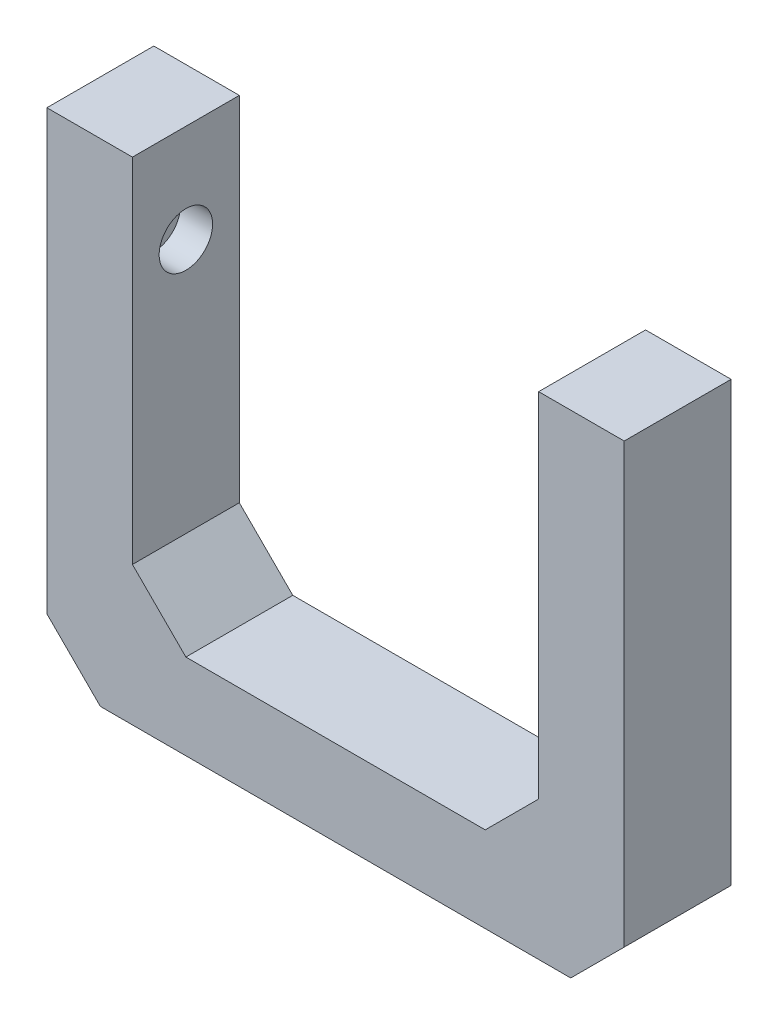
ISO-10303-21;
HEADER;
FILE_DESCRIPTION(('STEP AP214'),'2;1');
FILE_NAME('part.step','',(''),(''),'','','');
FILE_SCHEMA(('AUTOMOTIVE_DESIGN { 1 0 10303 214 1 1 1 1 }'));
ENDSEC;
DATA;
#1=APPLICATION_CONTEXT('core data for automotive mechanical design processes');
#2=APPLICATION_PROTOCOL_DEFINITION('international standard','automotive_design',2000,#1);
#3=PRODUCT_CONTEXT('',#1,'mechanical');
#4=PRODUCT('Part','Part','',(#3));
#5=PRODUCT_RELATED_PRODUCT_CATEGORY('part','',(#4));
#6=PRODUCT_DEFINITION_FORMATION('','',#4);
#7=PRODUCT_DEFINITION_CONTEXT('part definition',#1,'design');
#8=PRODUCT_DEFINITION('design','',#6,#7);
#9=PRODUCT_DEFINITION_SHAPE('','',#8);
#10=(LENGTH_UNIT() NAMED_UNIT(*) SI_UNIT(.MILLI.,.METRE.));
#11=(NAMED_UNIT(*) PLANE_ANGLE_UNIT() SI_UNIT($,.RADIAN.));
#12=(NAMED_UNIT(*) SI_UNIT($,.STERADIAN.) SOLID_ANGLE_UNIT());
#13=UNCERTAINTY_MEASURE_WITH_UNIT(LENGTH_MEASURE(1.E-05),#10,'distance_accuracy_value','');
#14=(GEOMETRIC_REPRESENTATION_CONTEXT(3) GLOBAL_UNCERTAINTY_ASSIGNED_CONTEXT((#13)) GLOBAL_UNIT_ASSIGNED_CONTEXT((#10,
#11,#12)) REPRESENTATION_CONTEXT('',''));
#15=CARTESIAN_POINT('',(0.,0.,0.));
#16=DIRECTION('',(0.,0.,1.));
#17=DIRECTION('',(1.,0.,0.));
#18=AXIS2_PLACEMENT_3D('',#15,#16,#17);
#19=CARTESIAN_POINT('',(-27.,-3.00000000000001,10.));
#20=DIRECTION('',(1.,0.,0.));
#21=DIRECTION('',(0.,1.,0.));
#22=AXIS2_PLACEMENT_3D('',#19,#20,#21);
#23=PLANE('',#22);
#24=DIRECTION('',(0.,-1.,0.));
#25=VECTOR('',#24,1.);
#26=CARTESIAN_POINT('',(-27.,-3.00000000000001,0.));
#27=LINE('',#26,#25);
#28=CARTESIAN_POINT('',(-27.,38.,0.));
#29=VERTEX_POINT('',#28);
#30=CARTESIAN_POINT('',(-27.,-3.00000000000001,0.));
#31=VERTEX_POINT('',#30);
#32=EDGE_CURVE('E163',#29,#31,#27,.T.);
#33=ORIENTED_EDGE('',*,*,#32,.T.);
#34=DIRECTION('',(0.,0.,-1.));
#35=VECTOR('',#34,1.);
#36=CARTESIAN_POINT('',(-27.,-3.00000000000001,10.));
#37=LINE('',#36,#35);
#38=CARTESIAN_POINT('',(-27.,-3.00000000000001,10.));
#39=VERTEX_POINT('',#38);
#40=EDGE_CURVE('E11',#39,#31,#37,.T.);
#41=ORIENTED_EDGE('',*,*,#40,.F.);
#42=DIRECTION('',(0.,-1.,0.));
#43=VECTOR('',#42,1.);
#44=CARTESIAN_POINT('',(-27.,-3.00000000000001,10.));
#45=LINE('',#44,#43);
#46=CARTESIAN_POINT('',(-27.,38.,10.));
#47=VERTEX_POINT('',#46);
#48=EDGE_CURVE('E186',#47,#39,#45,.T.);
#49=ORIENTED_EDGE('',*,*,#48,.F.);
#50=DIRECTION('',(0.,0.,-1.));
#51=VECTOR('',#50,1.);
#52=CARTESIAN_POINT('',(-27.,38.,10.));
#53=LINE('',#52,#51);
#54=EDGE_CURVE('E159',#47,#29,#53,.T.);
#55=ORIENTED_EDGE('',*,*,#54,.T.);
#56=EDGE_LOOP('',(#33,#41,#49,#55));
#57=FACE_BOUND('',#56,.T.);
#58=ADVANCED_FACE('F43',(#57),#23,.F.);
#59=CARTESIAN_POINT('',(-22.,-8.00000000000001,10.));
#60=DIRECTION('',(0.707106781186547,0.707106781186548,0.));
#61=DIRECTION('',(-0.707106781186548,0.707106781186547,0.));
#62=AXIS2_PLACEMENT_3D('',#59,#60,#61);
#63=PLANE('',#62);
#64=DIRECTION('',(0.707106781186548,-0.707106781186547,0.));
#65=VECTOR('',#64,1.);
#66=CARTESIAN_POINT('',(-22.,-8.00000000000001,0.));
#67=LINE('',#66,#65);
#68=CARTESIAN_POINT('',(-22.,-8.00000000000001,0.));
#69=VERTEX_POINT('',#68);
#70=EDGE_CURVE('E166',#31,#69,#67,.T.);
#71=ORIENTED_EDGE('',*,*,#70,.T.);
#72=DIRECTION('',(0.,0.,-1.));
#73=VECTOR('',#72,1.);
#74=CARTESIAN_POINT('',(-22.,-8.00000000000001,10.));
#75=LINE('',#74,#73);
#76=CARTESIAN_POINT('',(-22.,-8.00000000000001,10.));
#77=VERTEX_POINT('',#76);
#78=EDGE_CURVE('E51',#77,#69,#75,.T.);
#79=ORIENTED_EDGE('',*,*,#78,.F.);
#80=DIRECTION('',(0.707106781186548,-0.707106781186547,0.));
#81=VECTOR('',#80,1.);
#82=CARTESIAN_POINT('',(-22.,-8.00000000000001,10.));
#83=LINE('',#82,#81);
#84=EDGE_CURVE('E114',#39,#77,#83,.T.);
#85=ORIENTED_EDGE('',*,*,#84,.F.);
#86=ORIENTED_EDGE('',*,*,#40,.T.);
#87=EDGE_LOOP('',(#71,#79,#85,#86));
#88=FACE_BOUND('',#87,.T.);
#89=ADVANCED_FACE('F265',(#88),#63,.F.);
#90=CARTESIAN_POINT('',(22.,-7.99999999999999,10.));
#91=DIRECTION('',(0.,1.,0.));
#92=DIRECTION('',(-1.,0.,0.));
#93=AXIS2_PLACEMENT_3D('',#90,#91,#92);
#94=PLANE('',#93);
#95=DIRECTION('',(1.,0.,0.));
#96=VECTOR('',#95,1.);
#97=CARTESIAN_POINT('',(22.,-7.99999999999999,0.));
#98=LINE('',#97,#96);
#99=CARTESIAN_POINT('',(22.,-7.99999999999999,0.));
#100=VERTEX_POINT('',#99);
#101=EDGE_CURVE('E169',#69,#100,#98,.T.);
#102=ORIENTED_EDGE('',*,*,#101,.T.);
#103=DIRECTION('',(0.,0.,-1.));
#104=VECTOR('',#103,1.);
#105=CARTESIAN_POINT('',(22.,-7.99999999999999,10.));
#106=LINE('',#105,#104);
#107=CARTESIAN_POINT('',(22.,-7.99999999999999,10.));
#108=VERTEX_POINT('',#107);
#109=EDGE_CURVE('E205',#108,#100,#106,.T.);
#110=ORIENTED_EDGE('',*,*,#109,.F.);
#111=DIRECTION('',(1.,0.,0.));
#112=VECTOR('',#111,1.);
#113=CARTESIAN_POINT('',(22.,-7.99999999999999,10.));
#114=LINE('',#113,#112);
#115=EDGE_CURVE('E213',#77,#108,#114,.T.);
#116=ORIENTED_EDGE('',*,*,#115,.F.);
#117=ORIENTED_EDGE('',*,*,#78,.T.);
#118=EDGE_LOOP('',(#102,#110,#116,#117));
#119=FACE_BOUND('',#118,.T.);
#120=ADVANCED_FACE('F211',(#119),#94,.F.);
#121=CARTESIAN_POINT('',(27.,-2.99999999999999,10.));
#122=DIRECTION('',(-0.707106781186548,0.707106781186547,0.));
#123=DIRECTION('',(-0.707106781186547,-0.707106781186548,0.));
#124=AXIS2_PLACEMENT_3D('',#121,#122,#123);
#125=PLANE('',#124);
#126=DIRECTION('',(0.707106781186547,0.707106781186548,0.));
#127=VECTOR('',#126,1.);
#128=CARTESIAN_POINT('',(27.,-2.99999999999999,0.));
#129=LINE('',#128,#127);
#130=CARTESIAN_POINT('',(27.,-2.99999999999999,0.));
#131=VERTEX_POINT('',#130);
#132=EDGE_CURVE('E171',#100,#131,#129,.T.);
#133=ORIENTED_EDGE('',*,*,#132,.T.);
#134=DIRECTION('',(0.,0.,-1.));
#135=VECTOR('',#134,1.);
#136=CARTESIAN_POINT('',(27.,-2.99999999999999,10.));
#137=LINE('',#136,#135);
#138=CARTESIAN_POINT('',(27.,-2.99999999999999,10.));
#139=VERTEX_POINT('',#138);
#140=EDGE_CURVE('E202',#139,#131,#137,.T.);
#141=ORIENTED_EDGE('',*,*,#140,.F.);
#142=DIRECTION('',(0.707106781186547,0.707106781186548,0.));
#143=VECTOR('',#142,1.);
#144=CARTESIAN_POINT('',(27.,-2.99999999999999,10.));
#145=LINE('',#144,#143);
#146=EDGE_CURVE('E231',#108,#139,#145,.T.);
#147=ORIENTED_EDGE('',*,*,#146,.F.);
#148=ORIENTED_EDGE('',*,*,#109,.T.);
#149=EDGE_LOOP('',(#133,#141,#147,#148));
#150=FACE_BOUND('',#149,.T.);
#151=ADVANCED_FACE('F222',(#150),#125,.F.);
#152=CARTESIAN_POINT('',(27.,38.,10.));
#153=DIRECTION('',(-1.,0.,0.));
#154=DIRECTION('',(0.,-1.,0.));
#155=AXIS2_PLACEMENT_3D('',#152,#153,#154);
#156=PLANE('',#155);
#157=DIRECTION('',(0.,1.,0.));
#158=VECTOR('',#157,1.);
#159=CARTESIAN_POINT('',(27.,38.,0.));
#160=LINE('',#159,#158);
#161=CARTESIAN_POINT('',(27.,38.,0.));
#162=VERTEX_POINT('',#161);
#163=EDGE_CURVE('E173',#131,#162,#160,.T.);
#164=ORIENTED_EDGE('',*,*,#163,.T.);
#165=DIRECTION('',(0.,0.,-1.));
#166=VECTOR('',#165,1.);
#167=CARTESIAN_POINT('',(27.,38.,10.));
#168=LINE('',#167,#166);
#169=CARTESIAN_POINT('',(27.,38.,10.));
#170=VERTEX_POINT('',#169);
#171=EDGE_CURVE('E199',#170,#162,#168,.T.);
#172=ORIENTED_EDGE('',*,*,#171,.F.);
#173=DIRECTION('',(0.,1.,0.));
#174=VECTOR('',#173,1.);
#175=CARTESIAN_POINT('',(27.,38.,10.));
#176=LINE('',#175,#174);
#177=EDGE_CURVE('E228',#139,#170,#176,.T.);
#178=ORIENTED_EDGE('',*,*,#177,.F.);
#179=ORIENTED_EDGE('',*,*,#140,.T.);
#180=EDGE_LOOP('',(#164,#172,#178,#179));
#181=FACE_BOUND('',#180,.T.);
#182=ADVANCED_FACE('F226',(#181),#156,.F.);
#183=CARTESIAN_POINT('',(19.,38.,10.));
#184=DIRECTION('',(0.,-1.,0.));
#185=DIRECTION('',(1.,0.,0.));
#186=AXIS2_PLACEMENT_3D('',#183,#184,#185);
#187=PLANE('',#186);
#188=DIRECTION('',(-1.,0.,0.));
#189=VECTOR('',#188,1.);
#190=CARTESIAN_POINT('',(19.,38.,0.));
#191=LINE('',#190,#189);
#192=CARTESIAN_POINT('',(19.,38.,0.));
#193=VERTEX_POINT('',#192);
#194=EDGE_CURVE('E175',#162,#193,#191,.T.);
#195=ORIENTED_EDGE('',*,*,#194,.T.);
#196=DIRECTION('',(0.,0.,-1.));
#197=VECTOR('',#196,1.);
#198=CARTESIAN_POINT('',(19.,38.,10.));
#199=LINE('',#198,#197);
#200=CARTESIAN_POINT('',(19.,38.,10.));
#201=VERTEX_POINT('',#200);
#202=EDGE_CURVE('E196',#201,#193,#199,.T.);
#203=ORIENTED_EDGE('',*,*,#202,.F.);
#204=DIRECTION('',(-1.,0.,0.));
#205=VECTOR('',#204,1.);
#206=CARTESIAN_POINT('',(19.,38.,10.));
#207=LINE('',#206,#205);
#208=EDGE_CURVE('E230',#170,#201,#207,.T.);
#209=ORIENTED_EDGE('',*,*,#208,.F.);
#210=ORIENTED_EDGE('',*,*,#171,.T.);
#211=EDGE_LOOP('',(#195,#203,#209,#210));
#212=FACE_BOUND('',#211,.T.);
#213=ADVANCED_FACE('F278',(#212),#187,.F.);
#214=CARTESIAN_POINT('',(19.,5.,10.));
#215=DIRECTION('',(1.,0.,0.));
#216=DIRECTION('',(0.,1.,0.));
#217=AXIS2_PLACEMENT_3D('',#214,#215,#216);
#218=PLANE('',#217);
#219=DIRECTION('',(0.,-1.,0.));
#220=VECTOR('',#219,1.);
#221=CARTESIAN_POINT('',(19.,5.,0.));
#222=LINE('',#221,#220);
#223=CARTESIAN_POINT('',(19.,5.,0.));
#224=VERTEX_POINT('',#223);
#225=EDGE_CURVE('E177',#193,#224,#222,.T.);
#226=ORIENTED_EDGE('',*,*,#225,.T.);
#227=DIRECTION('',(0.,0.,-1.));
#228=VECTOR('',#227,1.);
#229=CARTESIAN_POINT('',(19.,5.,10.));
#230=LINE('',#229,#228);
#231=CARTESIAN_POINT('',(19.,5.,10.));
#232=VERTEX_POINT('',#231);
#233=EDGE_CURVE('E193',#232,#224,#230,.T.);
#234=ORIENTED_EDGE('',*,*,#233,.F.);
#235=DIRECTION('',(0.,-1.,0.));
#236=VECTOR('',#235,1.);
#237=CARTESIAN_POINT('',(19.,5.,10.));
#238=LINE('',#237,#236);
#239=EDGE_CURVE('E233',#201,#232,#238,.T.);
#240=ORIENTED_EDGE('',*,*,#239,.F.);
#241=ORIENTED_EDGE('',*,*,#202,.T.);
#242=EDGE_LOOP('',(#226,#234,#240,#241));
#243=FACE_BOUND('',#242,.T.);
#244=ADVANCED_FACE('F281',(#243),#218,.F.);
#245=CARTESIAN_POINT('',(14.,0.,10.));
#246=DIRECTION('',(0.707106781186547,-0.707106781186548,0.));
#247=DIRECTION('',(0.707106781186548,0.707106781186547,0.));
#248=AXIS2_PLACEMENT_3D('',#245,#246,#247);
#249=PLANE('',#248);
#250=DIRECTION('',(-0.707106781186548,-0.707106781186547,0.));
#251=VECTOR('',#250,1.);
#252=CARTESIAN_POINT('',(14.,0.,0.));
#253=LINE('',#252,#251);
#254=CARTESIAN_POINT('',(14.,0.,0.));
#255=VERTEX_POINT('',#254);
#256=EDGE_CURVE('E179',#224,#255,#253,.T.);
#257=ORIENTED_EDGE('',*,*,#256,.T.);
#258=DIRECTION('',(0.,0.,-1.));
#259=VECTOR('',#258,1.);
#260=CARTESIAN_POINT('',(14.,0.,10.));
#261=LINE('',#260,#259);
#262=CARTESIAN_POINT('',(14.,0.,10.));
#263=VERTEX_POINT('',#262);
#264=EDGE_CURVE('E190',#263,#255,#261,.T.);
#265=ORIENTED_EDGE('',*,*,#264,.F.);
#266=DIRECTION('',(-0.707106781186548,-0.707106781186547,0.));
#267=VECTOR('',#266,1.);
#268=CARTESIAN_POINT('',(14.,0.,10.));
#269=LINE('',#268,#267);
#270=EDGE_CURVE('E239',#232,#263,#269,.T.);
#271=ORIENTED_EDGE('',*,*,#270,.F.);
#272=ORIENTED_EDGE('',*,*,#233,.T.);
#273=EDGE_LOOP('',(#257,#265,#271,#272));
#274=FACE_BOUND('',#273,.T.);
#275=ADVANCED_FACE('F245',(#274),#249,.F.);
#276=CARTESIAN_POINT('',(-14.,0.,10.));
#277=DIRECTION('',(0.,-1.,0.));
#278=DIRECTION('',(0.,0.,-1.));
#279=AXIS2_PLACEMENT_3D('',#276,#277,#278);
#280=PLANE('',#279);
#281=DIRECTION('',(-1.,0.,0.));
#282=VECTOR('',#281,1.);
#283=CARTESIAN_POINT('',(-14.,0.,0.));
#284=LINE('',#283,#282);
#285=CARTESIAN_POINT('',(-14.,0.,0.));
#286=VERTEX_POINT('',#285);
#287=EDGE_CURVE('E181',#255,#286,#284,.T.);
#288=ORIENTED_EDGE('',*,*,#287,.T.);
#289=DIRECTION('',(0.,0.,-1.));
#290=VECTOR('',#289,1.);
#291=CARTESIAN_POINT('',(-14.,0.,10.));
#292=LINE('',#291,#290);
#293=CARTESIAN_POINT('',(-14.,0.,10.));
#294=VERTEX_POINT('',#293);
#295=EDGE_CURVE('E154',#294,#286,#292,.T.);
#296=ORIENTED_EDGE('',*,*,#295,.F.);
#297=DIRECTION('',(-1.,0.,0.));
#298=VECTOR('',#297,1.);
#299=CARTESIAN_POINT('',(-14.,0.,10.));
#300=LINE('',#299,#298);
#301=EDGE_CURVE('E145',#263,#294,#300,.T.);
#302=ORIENTED_EDGE('',*,*,#301,.F.);
#303=ORIENTED_EDGE('',*,*,#264,.T.);
#304=EDGE_LOOP('',(#288,#296,#302,#303));
#305=FACE_BOUND('',#304,.T.);
#306=ADVANCED_FACE('F249',(#305),#280,.F.);
#307=CARTESIAN_POINT('',(-19.,5.,10.));
#308=DIRECTION('',(-0.707106781186547,-0.707106781186548,0.));
#309=DIRECTION('',(0.707106781186548,-0.707106781186547,0.));
#310=AXIS2_PLACEMENT_3D('',#307,#308,#309);
#311=PLANE('',#310);
#312=DIRECTION('',(-0.707106781186548,0.707106781186547,0.));
#313=VECTOR('',#312,1.);
#314=CARTESIAN_POINT('',(-19.,5.,0.));
#315=LINE('',#314,#313);
#316=CARTESIAN_POINT('',(-19.,5.,0.));
#317=VERTEX_POINT('',#316);
#318=EDGE_CURVE('E153',#286,#317,#315,.T.);
#319=ORIENTED_EDGE('',*,*,#318,.T.);
#320=DIRECTION('',(0.,0.,-1.));
#321=VECTOR('',#320,1.);
#322=CARTESIAN_POINT('',(-19.,5.,10.));
#323=LINE('',#322,#321);
#324=CARTESIAN_POINT('',(-19.,5.,10.));
#325=VERTEX_POINT('',#324);
#326=EDGE_CURVE('E150',#325,#317,#323,.T.);
#327=ORIENTED_EDGE('',*,*,#326,.F.);
#328=DIRECTION('',(-0.707106781186548,0.707106781186547,0.));
#329=VECTOR('',#328,1.);
#330=CARTESIAN_POINT('',(-19.,5.,10.));
#331=LINE('',#330,#329);
#332=EDGE_CURVE('E139',#294,#325,#331,.T.);
#333=ORIENTED_EDGE('',*,*,#332,.F.);
#334=ORIENTED_EDGE('',*,*,#295,.T.);
#335=EDGE_LOOP('',(#319,#327,#333,#334));
#336=FACE_BOUND('',#335,.T.);
#337=ADVANCED_FACE('F151',(#336),#311,.F.);
#338=CARTESIAN_POINT('',(-19.,38.,10.));
#339=DIRECTION('',(-1.,0.,0.));
#340=DIRECTION('',(0.,-1.,0.));
#341=AXIS2_PLACEMENT_3D('',#338,#339,#340);
#342=PLANE('',#341);
#343=CARTESIAN_POINT('',(-19.,28.83,5.));
#344=DIRECTION('',(1.,0.,0.));
#345=DIRECTION('',(0.,1.,0.));
#346=AXIS2_PLACEMENT_3D('',#343,#344,#345);
#347=CIRCLE('',#346,2.5);
#348=CARTESIAN_POINT('',(-19.,31.33,5.));
#349=VERTEX_POINT('',#348);
#350=EDGE_CURVE('E456',#349,#349,#347,.T.);
#351=ORIENTED_EDGE('',*,*,#350,.F.);
#352=EDGE_LOOP('',(#351));
#353=FACE_BOUND('',#352,.T.);
#354=DIRECTION('',(0.,1.,0.));
#355=VECTOR('',#354,1.);
#356=CARTESIAN_POINT('',(-19.,38.,0.));
#357=LINE('',#356,#355);
#358=CARTESIAN_POINT('',(-19.,38.,0.));
#359=VERTEX_POINT('',#358);
#360=EDGE_CURVE('E100',#317,#359,#357,.T.);
#361=ORIENTED_EDGE('',*,*,#360,.T.);
#362=DIRECTION('',(0.,0.,-1.));
#363=VECTOR('',#362,1.);
#364=CARTESIAN_POINT('',(-19.,38.,10.));
#365=LINE('',#364,#363);
#366=CARTESIAN_POINT('',(-19.,38.,10.));
#367=VERTEX_POINT('',#366);
#368=EDGE_CURVE('E155',#367,#359,#365,.T.);
#369=ORIENTED_EDGE('',*,*,#368,.F.);
#370=DIRECTION('',(0.,1.,0.));
#371=VECTOR('',#370,1.);
#372=CARTESIAN_POINT('',(-19.,38.,10.));
#373=LINE('',#372,#371);
#374=EDGE_CURVE('E143',#325,#367,#373,.T.);
#375=ORIENTED_EDGE('',*,*,#374,.F.);
#376=ORIENTED_EDGE('',*,*,#326,.T.);
#377=EDGE_LOOP('',(#361,#369,#375,#376));
#378=FACE_BOUND('',#377,.T.);
#379=ADVANCED_FACE('F157',(#353,#378),#342,.F.);
#380=CARTESIAN_POINT('',(-27.,38.,10.));
#381=DIRECTION('',(0.,-1.,0.));
#382=DIRECTION('',(0.,0.,-1.));
#383=AXIS2_PLACEMENT_3D('',#380,#381,#382);
#384=PLANE('',#383);
#385=DIRECTION('',(-1.,0.,0.));
#386=VECTOR('',#385,1.);
#387=CARTESIAN_POINT('',(-27.,38.,0.));
#388=LINE('',#387,#386);
#389=EDGE_CURVE('E106',#359,#29,#388,.T.);
#390=ORIENTED_EDGE('',*,*,#389,.T.);
#391=ORIENTED_EDGE('',*,*,#54,.F.);
#392=DIRECTION('',(-1.,0.,0.));
#393=VECTOR('',#392,1.);
#394=CARTESIAN_POINT('',(-27.,38.,10.));
#395=LINE('',#394,#393);
#396=EDGE_CURVE('E59',#367,#47,#395,.T.);
#397=ORIENTED_EDGE('',*,*,#396,.F.);
#398=ORIENTED_EDGE('',*,*,#368,.T.);
#399=EDGE_LOOP('',(#390,#391,#397,#398));
#400=FACE_BOUND('',#399,.T.);
#401=ADVANCED_FACE('F253',(#400),#384,.F.);
#402=CARTESIAN_POINT('',(0.,0.,10.));
#403=DIRECTION('',(0.,0.,-1.));
#404=DIRECTION('',(-1.,0.,0.));
#405=AXIS2_PLACEMENT_3D('',#402,#403,#404);
#406=PLANE('',#405);
#407=ORIENTED_EDGE('',*,*,#48,.T.);
#408=ORIENTED_EDGE('',*,*,#84,.T.);
#409=ORIENTED_EDGE('',*,*,#115,.T.);
#410=ORIENTED_EDGE('',*,*,#146,.T.);
#411=ORIENTED_EDGE('',*,*,#177,.T.);
#412=ORIENTED_EDGE('',*,*,#208,.T.);
#413=ORIENTED_EDGE('',*,*,#239,.T.);
#414=ORIENTED_EDGE('',*,*,#270,.T.);
#415=ORIENTED_EDGE('',*,*,#301,.T.);
#416=ORIENTED_EDGE('',*,*,#332,.T.);
#417=ORIENTED_EDGE('',*,*,#374,.T.);
#418=ORIENTED_EDGE('',*,*,#396,.T.);
#419=EDGE_LOOP('',(#407,#408,#409,#410,#411,#412,#413,#414,#415,#416,#417,#418));
#420=FACE_BOUND('',#419,.T.);
#421=ADVANCED_FACE('F141',(#420),#406,.F.);
#422=CARTESIAN_POINT('',(0.,0.,0.));
#423=DIRECTION('',(0.,0.,-1.));
#424=DIRECTION('',(-1.,0.,0.));
#425=AXIS2_PLACEMENT_3D('',#422,#423,#424);
#426=PLANE('',#425);
#427=ORIENTED_EDGE('',*,*,#32,.F.);
#428=ORIENTED_EDGE('',*,*,#389,.F.);
#429=ORIENTED_EDGE('',*,*,#360,.F.);
#430=ORIENTED_EDGE('',*,*,#318,.F.);
#431=ORIENTED_EDGE('',*,*,#287,.F.);
#432=ORIENTED_EDGE('',*,*,#256,.F.);
#433=ORIENTED_EDGE('',*,*,#225,.F.);
#434=ORIENTED_EDGE('',*,*,#194,.F.);
#435=ORIENTED_EDGE('',*,*,#163,.F.);
#436=ORIENTED_EDGE('',*,*,#132,.F.);
#437=ORIENTED_EDGE('',*,*,#101,.F.);
#438=ORIENTED_EDGE('',*,*,#70,.F.);
#439=EDGE_LOOP('',(#427,#428,#429,#430,#431,#432,#433,#434,#435,#436,#437,#438));
#440=FACE_BOUND('',#439,.T.);
#441=ADVANCED_FACE('F217',(#440),#426,.T.);
#442=CARTESIAN_POINT('',(-22.,28.83,5.));
#443=DIRECTION('',(1.,0.,0.));
#444=DIRECTION('',(0.,1.,0.));
#445=AXIS2_PLACEMENT_3D('',#442,#443,#444);
#446=CYLINDRICAL_SURFACE('',#445,2.5);
#447=CARTESIAN_POINT('',(-22.,28.83,5.));
#448=DIRECTION('',(1.,0.,0.));
#449=DIRECTION('',(0.,1.,0.));
#450=AXIS2_PLACEMENT_3D('',#447,#448,#449);
#451=CIRCLE('',#450,2.5);
#452=CARTESIAN_POINT('',(-22.,31.33,5.));
#453=VERTEX_POINT('',#452);
#454=EDGE_CURVE('E167',#453,#453,#451,.T.);
#455=ORIENTED_EDGE('',*,*,#454,.F.);
#456=EDGE_LOOP('',(#455));
#457=FACE_BOUND('',#456,.T.);
#458=ORIENTED_EDGE('',*,*,#350,.T.);
#459=EDGE_LOOP('',(#458));
#460=FACE_BOUND('',#459,.T.);
#461=ADVANCED_FACE('F319',(#457,#460),#446,.F.);
#462=CARTESIAN_POINT('',(-22.,28.83,5.));
#463=DIRECTION('',(1.,0.,0.));
#464=DIRECTION('',(0.,1.,0.));
#465=AXIS2_PLACEMENT_3D('',#462,#463,#464);
#466=PLANE('',#465);
#467=ORIENTED_EDGE('',*,*,#454,.T.);
#468=EDGE_LOOP('',(#467));
#469=FACE_BOUND('',#468,.T.);
#470=ADVANCED_FACE('F326',(#469),#466,.T.);
#471=CLOSED_SHELL('',(#58,#89,#120,#151,#182,#213,#244,#275,#306,#337,#379,#401,#421,#441,#461,#470));
#472=MANIFOLD_SOLID_BREP('B2',#471);
#473=ADVANCED_BREP_SHAPE_REPRESENTATION('',(#18,#472),#14);
#474=SHAPE_DEFINITION_REPRESENTATION(#9,#473);
ENDSEC;
END-ISO-10303-21;
